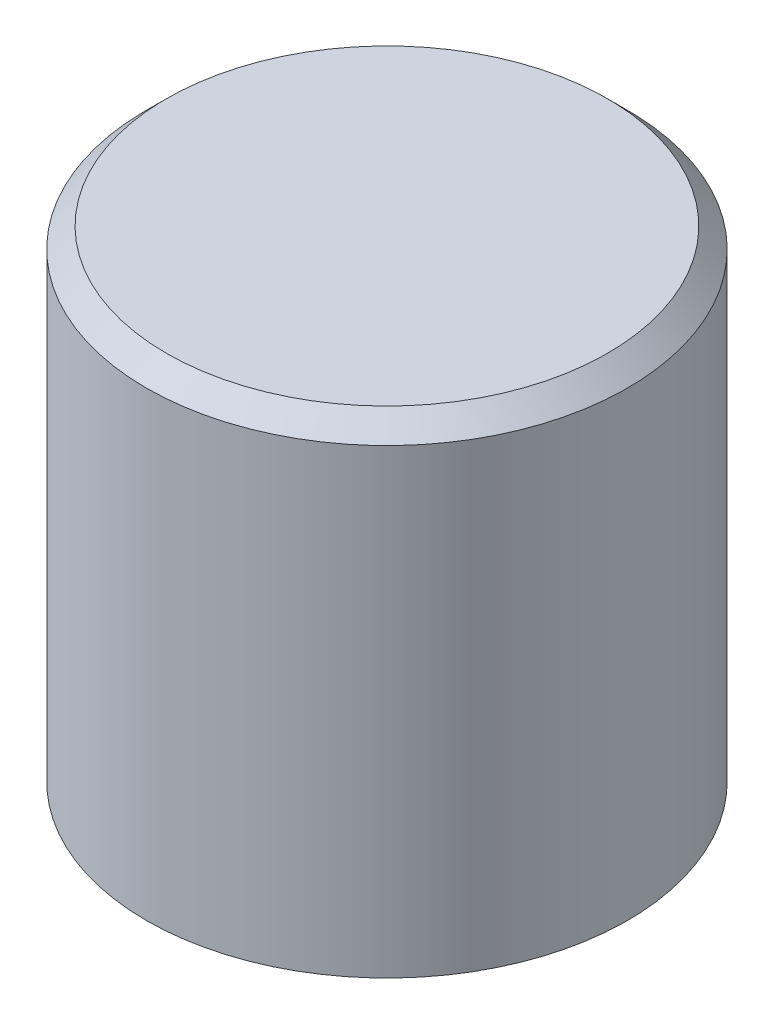
ISO-10303-21;
HEADER;
FILE_DESCRIPTION(('STEP AP214'),'2;1');
FILE_NAME('part.step','',(''),(''),'','','');
FILE_SCHEMA(('AUTOMOTIVE_DESIGN { 1 0 10303 214 1 1 1 1 }'));
ENDSEC;
DATA;
#1=APPLICATION_CONTEXT('core data for automotive mechanical design processes');
#2=APPLICATION_PROTOCOL_DEFINITION('international standard','automotive_design',2000,#1);
#3=PRODUCT_CONTEXT('',#1,'mechanical');
#4=PRODUCT('Part','Part','',(#3));
#5=PRODUCT_RELATED_PRODUCT_CATEGORY('part','',(#4));
#6=PRODUCT_DEFINITION_FORMATION('','',#4);
#7=PRODUCT_DEFINITION_CONTEXT('part definition',#1,'design');
#8=PRODUCT_DEFINITION('design','',#6,#7);
#9=PRODUCT_DEFINITION_SHAPE('','',#8);
#10=(LENGTH_UNIT() NAMED_UNIT(*) SI_UNIT(.MILLI.,.METRE.));
#11=(NAMED_UNIT(*) PLANE_ANGLE_UNIT() SI_UNIT($,.RADIAN.));
#12=(NAMED_UNIT(*) SI_UNIT($,.STERADIAN.) SOLID_ANGLE_UNIT());
#13=UNCERTAINTY_MEASURE_WITH_UNIT(LENGTH_MEASURE(1.E-05),#10,'distance_accuracy_value','');
#14=(GEOMETRIC_REPRESENTATION_CONTEXT(3) GLOBAL_UNCERTAINTY_ASSIGNED_CONTEXT((#13)) GLOBAL_UNIT_ASSIGNED_CONTEXT((#10,
#11,#12)) REPRESENTATION_CONTEXT('',''));
#15=CARTESIAN_POINT('',(0.,0.,0.));
#16=DIRECTION('',(0.,0.,1.));
#17=DIRECTION('',(1.,0.,0.));
#18=AXIS2_PLACEMENT_3D('',#15,#16,#17);
#19=CARTESIAN_POINT('',(0.,12.,0.));
#20=DIRECTION('',(0.,-1.,0.));
#21=DIRECTION('',(0.,0.,-1.));
#22=AXIS2_PLACEMENT_3D('',#19,#20,#21);
#23=CYLINDRICAL_SURFACE('',#22,6.);
#24=CARTESIAN_POINT('',(0.,11.5,0.));
#25=DIRECTION('',(0.,1.,0.));
#26=DIRECTION('',(0.,0.,1.));
#27=AXIS2_PLACEMENT_3D('',#24,#25,#26);
#28=CIRCLE('',#27,6.);
#29=CARTESIAN_POINT('',(0.,11.5,6.));
#30=VERTEX_POINT('',#29);
#31=EDGE_CURVE('E10',#30,#30,#28,.F.);
#32=ORIENTED_EDGE('',*,*,#31,.T.);
#33=EDGE_LOOP('',(#32));
#34=FACE_BOUND('',#33,.T.);
#35=CARTESIAN_POINT('',(0.,0.,0.));
#36=DIRECTION('',(0.,1.,0.));
#37=DIRECTION('',(0.,0.,1.));
#38=AXIS2_PLACEMENT_3D('',#35,#36,#37);
#39=CIRCLE('',#38,6.);
#40=CARTESIAN_POINT('',(0.,0.,6.));
#41=VERTEX_POINT('',#40);
#42=EDGE_CURVE('E54',#41,#41,#39,.T.);
#43=ORIENTED_EDGE('',*,*,#42,.T.);
#44=EDGE_LOOP('',(#43));
#45=FACE_BOUND('',#44,.T.);
#46=ADVANCED_FACE('F33',(#34,#45),#23,.T.);
#47=CARTESIAN_POINT('',(0.,12.,0.));
#48=DIRECTION('',(0.,1.,0.));
#49=DIRECTION('',(0.,0.,1.));
#50=AXIS2_PLACEMENT_3D('',#47,#48,#49);
#51=PLANE('',#50);
#52=CARTESIAN_POINT('',(0.,12.,0.));
#53=DIRECTION('',(0.,1.,0.));
#54=DIRECTION('',(0.,0.,1.));
#55=AXIS2_PLACEMENT_3D('',#52,#53,#54);
#56=CIRCLE('',#55,5.5);
#57=CARTESIAN_POINT('',(0.,12.,5.5));
#58=VERTEX_POINT('',#57);
#59=EDGE_CURVE('E41',#58,#58,#56,.T.);
#60=ORIENTED_EDGE('',*,*,#59,.T.);
#61=EDGE_LOOP('',(#60));
#62=FACE_BOUND('',#61,.T.);
#63=ADVANCED_FACE('F82',(#62),#51,.T.);
#64=CARTESIAN_POINT('',(0.,0.,0.));
#65=DIRECTION('',(0.,1.,0.));
#66=DIRECTION('',(0.,0.,1.));
#67=AXIS2_PLACEMENT_3D('',#64,#65,#66);
#68=PLANE('',#67);
#69=CARTESIAN_POINT('',(0.,0.,0.));
#70=DIRECTION('',(0.,-1.,0.));
#71=DIRECTION('',(0.,0.,-1.));
#72=AXIS2_PLACEMENT_3D('',#69,#70,#71);
#73=CIRCLE('',#72,5.);
#74=CARTESIAN_POINT('',(0.,0.,-5.));
#75=VERTEX_POINT('',#74);
#76=EDGE_CURVE('E57',#75,#75,#73,.T.);
#77=ORIENTED_EDGE('',*,*,#76,.F.);
#78=EDGE_LOOP('',(#77));
#79=FACE_BOUND('',#78,.T.);
#80=ORIENTED_EDGE('',*,*,#42,.F.);
#81=EDGE_LOOP('',(#80));
#82=FACE_BOUND('',#81,.T.);
#83=ADVANCED_FACE('F72',(#79,#82),#68,.F.);
#84=CARTESIAN_POINT('',(0.,0.,0.));
#85=DIRECTION('',(0.,-1.,0.));
#86=DIRECTION('',(0.,0.,-1.));
#87=AXIS2_PLACEMENT_3D('',#84,#85,#86);
#88=CYLINDRICAL_SURFACE('',#87,5.);
#89=ORIENTED_EDGE('',*,*,#76,.T.);
#90=EDGE_LOOP('',(#89));
#91=FACE_BOUND('',#90,.T.);
#92=CARTESIAN_POINT('',(0.,3.,0.));
#93=DIRECTION('',(0.,-1.,0.));
#94=DIRECTION('',(0.,0.,-1.));
#95=AXIS2_PLACEMENT_3D('',#92,#93,#94);
#96=CIRCLE('',#95,5.);
#97=CARTESIAN_POINT('',(0.,3.,-5.));
#98=VERTEX_POINT('',#97);
#99=EDGE_CURVE('E63',#98,#98,#96,.T.);
#100=ORIENTED_EDGE('',*,*,#99,.F.);
#101=EDGE_LOOP('',(#100));
#102=FACE_BOUND('',#101,.T.);
#103=ADVANCED_FACE('F69',(#91,#102),#88,.F.);
#104=CARTESIAN_POINT('',(0.,8.5,0.));
#105=DIRECTION('',(0.,-1.,0.));
#106=DIRECTION('',(0.,0.,-1.));
#107=AXIS2_PLACEMENT_3D('',#104,#105,#106);
#108=PLANE('',#107);
#109=CARTESIAN_POINT('',(0.,8.5,0.));
#110=DIRECTION('',(0.,-1.,0.));
#111=DIRECTION('',(0.,0.,-1.));
#112=AXIS2_PLACEMENT_3D('',#109,#110,#111);
#113=CIRCLE('',#112,1.5);
#114=CARTESIAN_POINT('',(0.,8.5,-1.5));
#115=VERTEX_POINT('',#114);
#116=EDGE_CURVE('E60',#115,#115,#113,.T.);
#117=ORIENTED_EDGE('',*,*,#116,.T.);
#118=EDGE_LOOP('',(#117));
#119=FACE_BOUND('',#118,.T.);
#120=ADVANCED_FACE('F71',(#119),#108,.T.);
#121=CARTESIAN_POINT('',(0.,0.,0.));
#122=DIRECTION('',(0.,-1.,0.));
#123=DIRECTION('',(0.,0.,-1.));
#124=AXIS2_PLACEMENT_3D('',#121,#122,#123);
#125=CYLINDRICAL_SURFACE('',#124,1.5);
#126=CARTESIAN_POINT('',(0.,3.7404247376618,0.));
#127=DIRECTION('',(0.,-1.,0.));
#128=DIRECTION('',(0.,0.,-1.));
#129=AXIS2_PLACEMENT_3D('',#126,#127,#128);
#130=CIRCLE('',#129,1.5);
#131=CARTESIAN_POINT('',(0.,3.7404247376618,-1.5));
#132=VERTEX_POINT('',#131);
#133=EDGE_CURVE('E49',#132,#132,#130,.T.);
#134=ORIENTED_EDGE('',*,*,#133,.T.);
#135=EDGE_LOOP('',(#134));
#136=FACE_BOUND('',#135,.T.);
#137=ORIENTED_EDGE('',*,*,#116,.F.);
#138=EDGE_LOOP('',(#137));
#139=FACE_BOUND('',#138,.T.);
#140=ADVANCED_FACE('F79',(#136,#139),#125,.F.);
#141=CARTESIAN_POINT('',(0.,3.61714443247964,0.));
#142=DIRECTION('',(0.,-1.,0.));
#143=DIRECTION('',(0.,0.,-1.));
#144=AXIS2_PLACEMENT_3D('',#141,#142,#143);
#145=CONICAL_SURFACE('',#144,1.5,1.39626340159546);
#146=CARTESIAN_POINT('',(0.,3.59977961471295,0.));
#147=DIRECTION('',(0.,1.,0.));
#148=DIRECTION('',(0.,0.,1.));
#149=AXIS2_PLACEMENT_3D('',#146,#147,#148);
#150=CIRCLE('',#149,1.59848077530122);
#151=CARTESIAN_POINT('',(0.,3.59977961471295,-1.59848077530122));
#152=VERTEX_POINT('',#151);
#153=EDGE_CURVE('E45',#152,#152,#150,.T.);
#154=CARTESIAN_POINT('',(0.,3.59977961471295,-1.59848077530122));
#155=CARTESIAN_POINT('',(0.,3.59353191039302,-1.63391326722517));
#156=CARTESIAN_POINT('',(0.,3.58728420607309,-1.66934575914911));
#157=CARTESIAN_POINT('',(0.,3.57478879743324,-1.740210742997));
#158=CARTESIAN_POINT('',(0.,3.56854109311332,-1.77564323492095));
#159=CARTESIAN_POINT('',(0.,3.55604568447346,-1.84650821876884));
#160=CARTESIAN_POINT('',(0.,3.54979798015354,-1.88194071069279));
#161=CARTESIAN_POINT('',(0.,3.53730257151368,-1.95280569454068));
#162=CARTESIAN_POINT('',(0.,3.53105486719376,-1.98823818646462));
#163=CARTESIAN_POINT('',(0.,3.5185594585539,-2.05910317031251));
#164=CARTESIAN_POINT('',(0.,3.51231175423398,-2.09453566223646));
#165=CARTESIAN_POINT('',(0.,3.49981634559412,-2.16540064608435));
#166=CARTESIAN_POINT('',(0.,3.4935686412742,-2.2008331380083));
#167=CARTESIAN_POINT('',(0.,3.48107323263434,-2.27169812185619));
#168=CARTESIAN_POINT('',(0.,3.47482552831442,-2.30713061378013));
#169=CARTESIAN_POINT('',(0.,3.46233011967456,-2.37799559762802));
#170=CARTESIAN_POINT('',(0.,3.45608241535464,-2.41342808955197));
#171=CARTESIAN_POINT('',(0.,3.44358700671478,-2.48429307339986));
#172=CARTESIAN_POINT('',(0.,3.43733930239486,-2.51972556532381));
#173=CARTESIAN_POINT('',(0.,3.424843893755,-2.5905905491717));
#174=CARTESIAN_POINT('',(0.,3.41859618943508,-2.62602304109564));
#175=CARTESIAN_POINT('',(0.,3.40610078079522,-2.69688802494353));
#176=CARTESIAN_POINT('',(0.,3.3998530764753,-2.73232051686748));
#177=CARTESIAN_POINT('',(0.,3.38735766783545,-2.80318550071537));
#178=CARTESIAN_POINT('',(0.,3.38110996351552,-2.83861799263932));
#179=CARTESIAN_POINT('',(0.,3.36861455487567,-2.90948297648721));
#180=CARTESIAN_POINT('',(0.,3.36236685055574,-2.94491546841115));
#181=CARTESIAN_POINT('',(0.,3.34987144191589,-3.01578045225904));
#182=CARTESIAN_POINT('',(0.,3.34362373759596,-3.05121294418299));
#183=CARTESIAN_POINT('',(0.,3.33112832895611,-3.12207792803088));
#184=CARTESIAN_POINT('',(0.,3.32488062463618,-3.15751041995483));
#185=CARTESIAN_POINT('',(0.,3.31238521599633,-3.22837540380272));
#186=CARTESIAN_POINT('',(0.,3.3061375116764,-3.26380789572666));
#187=CARTESIAN_POINT('',(0.,3.29364210303655,-3.33467287957456));
#188=CARTESIAN_POINT('',(0.,3.28739439871662,-3.3701053714985));
#189=CARTESIAN_POINT('',(0.,3.27489899007677,-3.44097035534639));
#190=CARTESIAN_POINT('',(0.,3.26865128575684,-3.47640284727034));
#191=CARTESIAN_POINT('',(0.,3.25615587711699,-3.54726783111823));
#192=CARTESIAN_POINT('',(0.,3.24990817279706,-3.58270032304217));
#193=CARTESIAN_POINT('',(0.,3.23741276415721,-3.65356530689007));
#194=CARTESIAN_POINT('',(0.,3.23116505983728,-3.68899779881401));
#195=CARTESIAN_POINT('',(0.,3.21866965119743,-3.7598627826619));
#196=CARTESIAN_POINT('',(0.,3.2124219468775,-3.79529527458585));
#197=CARTESIAN_POINT('',(0.,3.19992653823765,-3.86616025843374));
#198=CARTESIAN_POINT('',(0.,3.19367883391772,-3.90159275035768));
#199=CARTESIAN_POINT('',(0.,3.18118342527787,-3.97245773420558));
#200=CARTESIAN_POINT('',(0.,3.17493572095794,-4.00789022612952));
#201=CARTESIAN_POINT('',(0.,3.16244031231809,-4.07875520997741));
#202=CARTESIAN_POINT('',(0.,3.15619260799816,-4.11418770190136));
#203=CARTESIAN_POINT('',(0.,3.14369719935831,-4.18505268574925));
#204=CARTESIAN_POINT('',(0.,3.13744949503838,-4.2204851776732));
#205=CARTESIAN_POINT('',(0.,3.12495408639853,-4.29135016152109));
#206=CARTESIAN_POINT('',(0.,3.1187063820786,-4.32678265344503));
#207=CARTESIAN_POINT('',(0.,3.10621097343875,-4.39764763729292));
#208=CARTESIAN_POINT('',(0.,3.09996326911882,-4.43308012921687));
#209=CARTESIAN_POINT('',(0.,3.08746786047897,-4.50394511306476));
#210=CARTESIAN_POINT('',(0.,3.08122015615905,-4.53937760498871));
#211=CARTESIAN_POINT('',(0.,3.06872474751919,-4.6102425888366));
#212=CARTESIAN_POINT('',(0.,3.06247704319927,-4.64567508076054));
#213=CARTESIAN_POINT('',(0.,3.04998163455941,-4.71654006460843));
#214=CARTESIAN_POINT('',(0.,3.04373393023949,-4.75197255653238));
#215=CARTESIAN_POINT('',(0.,3.03123852159963,-4.82283754038027));
#216=CARTESIAN_POINT('',(0.,3.02499081727971,-4.85827003230422));
#217=CARTESIAN_POINT('',(0.,3.01249540863985,-4.92913501615211));
#218=CARTESIAN_POINT('',(0.,3.00624770431993,-4.96456750807605));
#219=CARTESIAN_POINT('',(0.,3.,-5.));
#220=B_SPLINE_CURVE_WITH_KNOTS('',3,(#154,#155,#156,#157,#158,#159,#160,#161,#162,#163,#164,
#165,#166,#167,#168,#169,#170,#171,#172,#173,#174,#175,#176,#177,#178,#179,#180,#181,#182,#183,
#184,#185,#186,#187,#188,#189,#190,#191,#192,#193,#194,#195,#196,#197,#198,#199,#200,#201,#202,
#203,#204,#205,#206,#207,#208,#209,#210,#211,#212,#213,#214,#215,#216,#217,#218,#219),
.UNSPECIFIED.,.F.,.F.,(4,2,2,2,2,2,2,2,2,2,2,2,2,2,2,2,2,2,2,2,2,2,2,2,2,2,2,2,2,2,2,2,4),(0.,
0.107937285675003,0.215874571350007,0.32381185702501,0.431749142700014,0.539686428375017,
0.647623714050021,0.755560999725024,0.863498285400027,0.97143557107503,1.07937285675003,
1.18731014242504,1.29524742810004,1.40318471377504,1.51112199945005,1.61905928512505,
1.72699657080005,1.83493385647506,1.94287114215006,2.05080842782506,2.15874571350007,
2.26668299917507,2.37462028485007,2.48255757052508,2.59049485620008,2.69843214187508,
2.80636942755009,2.91430671322509,3.0222439989001,3.1301812845751,3.2381185702501,
3.3460558559251,3.45399314160011),.UNSPECIFIED.);
#221=EDGE_CURVE('BSEAM67',#152,#98,#220,.T.);
#222=ORIENTED_EDGE('',*,*,#153,.T.);
#223=ORIENTED_EDGE('',*,*,#99,.T.);
#224=ORIENTED_EDGE('',*,*,#221,.T.);
#225=ORIENTED_EDGE('',*,*,#221,.F.);
#226=EDGE_LOOP('',(#222,#224,#223,#225));
#227=FACE_BOUND('',#226,.T.);
#228=ADVANCED_FACE('F67',(#227),#145,.F.);
#229=CARTESIAN_POINT('',(0.,3.7404247376618,0.));
#230=DIRECTION('',(0.,-1.,0.));
#231=DIRECTION('',(0.,0.,-1.));
#232=AXIS2_PLACEMENT_3D('',#229,#230,#231);
#233=CONICAL_SURFACE('',#232,1.5,0.610865238198017);
#234=ORIENTED_EDGE('',*,*,#153,.F.);
#235=EDGE_LOOP('',(#234));
#236=FACE_BOUND('',#235,.T.);
#237=ORIENTED_EDGE('',*,*,#133,.F.);
#238=EDGE_LOOP('',(#237));
#239=FACE_BOUND('',#238,.T.);
#240=ADVANCED_FACE('F93',(#236,#239),#233,.F.);
#241=CARTESIAN_POINT('',(0.,12.,0.));
#242=DIRECTION('',(0.,-1.,0.));
#243=DIRECTION('',(0.,0.,-1.));
#244=AXIS2_PLACEMENT_3D('',#241,#242,#243);
#245=CONICAL_SURFACE('',#244,5.5,0.785398163397447);
#246=ORIENTED_EDGE('',*,*,#31,.F.);
#247=EDGE_LOOP('',(#246));
#248=FACE_BOUND('',#247,.T.);
#249=ORIENTED_EDGE('',*,*,#59,.F.);
#250=EDGE_LOOP('',(#249));
#251=FACE_BOUND('',#250,.T.);
#252=ADVANCED_FACE('F36',(#248,#251),#245,.T.);
#253=CLOSED_SHELL('',(#46,#63,#83,#103,#120,#140,#228,#240,#252));
#254=MANIFOLD_SOLID_BREP('B2',#253);
#255=ADVANCED_BREP_SHAPE_REPRESENTATION('',(#18,#254),#14);
#256=SHAPE_DEFINITION_REPRESENTATION(#9,#255);
ENDSEC;
END-ISO-10303-21;
